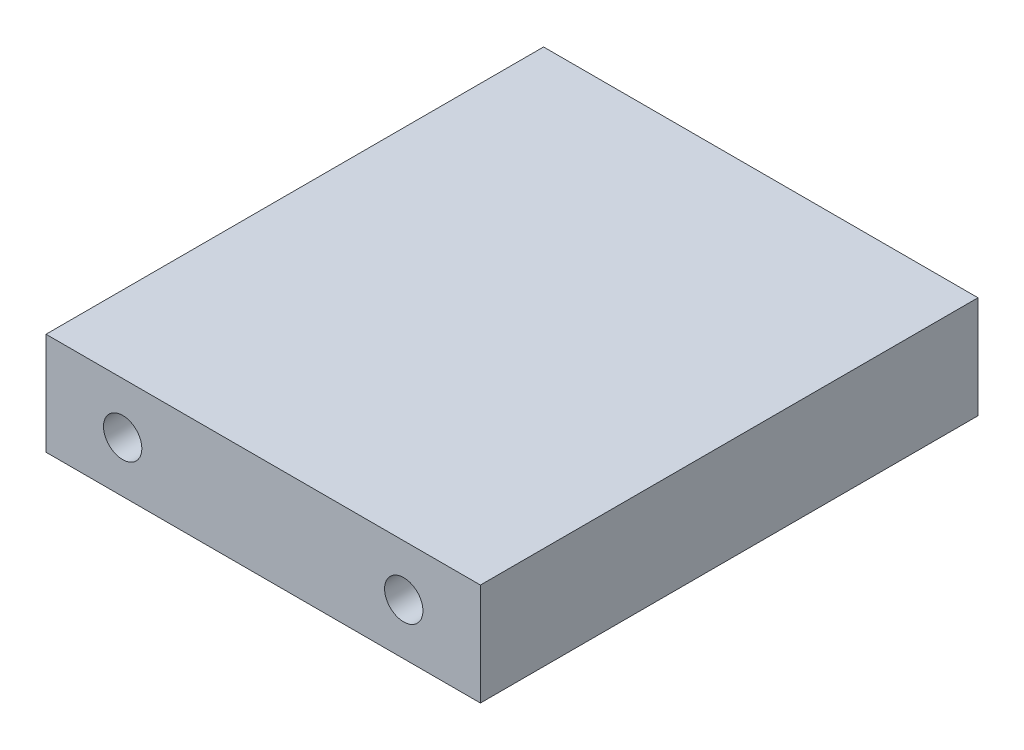
ISO-10303-21;
HEADER;
FILE_DESCRIPTION(('STEP AP214'),'2;1');
FILE_NAME('part.step','',(''),(''),'','','');
FILE_SCHEMA(('AUTOMOTIVE_DESIGN { 1 0 10303 214 1 1 1 1 }'));
ENDSEC;
DATA;
#1=APPLICATION_CONTEXT('core data for automotive mechanical design processes');
#2=APPLICATION_PROTOCOL_DEFINITION('international standard','automotive_design',2000,#1);
#3=PRODUCT_CONTEXT('',#1,'mechanical');
#4=PRODUCT('Part','Part','',(#3));
#5=PRODUCT_RELATED_PRODUCT_CATEGORY('part','',(#4));
#6=PRODUCT_DEFINITION_FORMATION('','',#4);
#7=PRODUCT_DEFINITION_CONTEXT('part definition',#1,'design');
#8=PRODUCT_DEFINITION('design','',#6,#7);
#9=PRODUCT_DEFINITION_SHAPE('','',#8);
#10=(LENGTH_UNIT() NAMED_UNIT(*) SI_UNIT(.MILLI.,.METRE.));
#11=(NAMED_UNIT(*) PLANE_ANGLE_UNIT() SI_UNIT($,.RADIAN.));
#12=(NAMED_UNIT(*) SI_UNIT($,.STERADIAN.) SOLID_ANGLE_UNIT());
#13=UNCERTAINTY_MEASURE_WITH_UNIT(LENGTH_MEASURE(1.E-05),#10,'distance_accuracy_value','');
#14=(GEOMETRIC_REPRESENTATION_CONTEXT(3) GLOBAL_UNCERTAINTY_ASSIGNED_CONTEXT((#13)) GLOBAL_UNIT_ASSIGNED_CONTEXT((#10,
#11,#12)) REPRESENTATION_CONTEXT('',''));
#15=CARTESIAN_POINT('',(0.,0.,0.));
#16=DIRECTION('',(0.,0.,1.));
#17=DIRECTION('',(1.,0.,0.));
#18=AXIS2_PLACEMENT_3D('',#15,#16,#17);
#19=CARTESIAN_POINT('',(0.,0.,123.65));
#20=DIRECTION('',(1.,0.,0.));
#21=DIRECTION('',(0.,0.,-1.));
#22=AXIS2_PLACEMENT_3D('',#19,#20,#21);
#23=PLANE('',#22);
#24=DIRECTION('',(0.,-1.,0.));
#25=VECTOR('',#24,1.);
#26=CARTESIAN_POINT('',(0.,0.,0.));
#27=LINE('',#26,#25);
#28=CARTESIAN_POINT('',(0.,0.,0.));
#29=VERTEX_POINT('',#28);
#30=CARTESIAN_POINT('',(0.,-25.4,0.));
#31=VERTEX_POINT('',#30);
#32=EDGE_CURVE('E125',#29,#31,#27,.T.);
#33=ORIENTED_EDGE('',*,*,#32,.T.);
#34=DIRECTION('',(0.,0.,-1.));
#35=VECTOR('',#34,1.);
#36=CARTESIAN_POINT('',(0.,-25.4,123.65));
#37=LINE('',#36,#35);
#38=CARTESIAN_POINT('',(0.,-25.4,123.65));
#39=VERTEX_POINT('',#38);
#40=EDGE_CURVE('E12',#39,#31,#37,.T.);
#41=ORIENTED_EDGE('',*,*,#40,.F.);
#42=DIRECTION('',(0.,-1.,0.));
#43=VECTOR('',#42,1.);
#44=CARTESIAN_POINT('',(0.,0.,123.65));
#45=LINE('',#44,#43);
#46=CARTESIAN_POINT('',(0.,0.,123.65));
#47=VERTEX_POINT('',#46);
#48=EDGE_CURVE('E108',#47,#39,#45,.T.);
#49=ORIENTED_EDGE('',*,*,#48,.F.);
#50=DIRECTION('',(0.,0.,-1.));
#51=VECTOR('',#50,1.);
#52=CARTESIAN_POINT('',(0.,0.,123.65));
#53=LINE('',#52,#51);
#54=EDGE_CURVE('E121',#47,#29,#53,.T.);
#55=ORIENTED_EDGE('',*,*,#54,.T.);
#56=EDGE_LOOP('',(#33,#41,#49,#55));
#57=FACE_BOUND('',#56,.T.);
#58=ADVANCED_FACE('F56',(#57),#23,.F.);
#59=CARTESIAN_POINT('',(0.,-25.4,123.65));
#60=DIRECTION('',(0.,1.,0.));
#61=DIRECTION('',(0.,0.,1.));
#62=AXIS2_PLACEMENT_3D('',#59,#60,#61);
#63=PLANE('',#62);
#64=DIRECTION('',(1.,0.,0.));
#65=VECTOR('',#64,1.);
#66=CARTESIAN_POINT('',(0.,-25.4,0.));
#67=LINE('',#66,#65);
#68=CARTESIAN_POINT('',(107.95,-25.4,0.));
#69=VERTEX_POINT('',#68);
#70=EDGE_CURVE('E113',#31,#69,#67,.T.);
#71=ORIENTED_EDGE('',*,*,#70,.T.);
#72=DIRECTION('',(0.,0.,-1.));
#73=VECTOR('',#72,1.);
#74=CARTESIAN_POINT('',(107.95,-25.4,123.65));
#75=LINE('',#74,#73);
#76=CARTESIAN_POINT('',(107.95,-25.4,123.65));
#77=VERTEX_POINT('',#76);
#78=EDGE_CURVE('E65',#77,#69,#75,.T.);
#79=ORIENTED_EDGE('',*,*,#78,.F.);
#80=DIRECTION('',(1.,0.,0.));
#81=VECTOR('',#80,1.);
#82=CARTESIAN_POINT('',(0.,-25.4,123.65));
#83=LINE('',#82,#81);
#84=EDGE_CURVE('E103',#39,#77,#83,.T.);
#85=ORIENTED_EDGE('',*,*,#84,.F.);
#86=ORIENTED_EDGE('',*,*,#40,.T.);
#87=EDGE_LOOP('',(#71,#79,#85,#86));
#88=FACE_BOUND('',#87,.T.);
#89=ADVANCED_FACE('F112',(#88),#63,.F.);
#90=CARTESIAN_POINT('',(107.95,0.,123.65));
#91=DIRECTION('',(-1.,0.,0.));
#92=DIRECTION('',(0.,0.,1.));
#93=AXIS2_PLACEMENT_3D('',#90,#91,#92);
#94=PLANE('',#93);
#95=DIRECTION('',(0.,1.,0.));
#96=VECTOR('',#95,1.);
#97=CARTESIAN_POINT('',(107.95,0.,0.));
#98=LINE('',#97,#96);
#99=CARTESIAN_POINT('',(107.95,0.,0.));
#100=VERTEX_POINT('',#99);
#101=EDGE_CURVE('E90',#69,#100,#98,.T.);
#102=ORIENTED_EDGE('',*,*,#101,.T.);
#103=DIRECTION('',(0.,0.,-1.));
#104=VECTOR('',#103,1.);
#105=CARTESIAN_POINT('',(107.95,0.,123.65));
#106=LINE('',#105,#104);
#107=CARTESIAN_POINT('',(107.95,0.,123.65));
#108=VERTEX_POINT('',#107);
#109=EDGE_CURVE('E115',#108,#100,#106,.T.);
#110=ORIENTED_EDGE('',*,*,#109,.F.);
#111=DIRECTION('',(0.,1.,0.));
#112=VECTOR('',#111,1.);
#113=CARTESIAN_POINT('',(107.95,0.,123.65));
#114=LINE('',#113,#112);
#115=EDGE_CURVE('E106',#77,#108,#114,.T.);
#116=ORIENTED_EDGE('',*,*,#115,.F.);
#117=ORIENTED_EDGE('',*,*,#78,.T.);
#118=EDGE_LOOP('',(#102,#110,#116,#117));
#119=FACE_BOUND('',#118,.T.);
#120=ADVANCED_FACE('F116',(#119),#94,.F.);
#121=CARTESIAN_POINT('',(0.,0.,123.65));
#122=DIRECTION('',(0.,-1.,0.));
#123=DIRECTION('',(0.,0.,-1.));
#124=AXIS2_PLACEMENT_3D('',#121,#122,#123);
#125=PLANE('',#124);
#126=DIRECTION('',(-1.,0.,0.));
#127=VECTOR('',#126,1.);
#128=CARTESIAN_POINT('',(0.,0.,0.));
#129=LINE('',#128,#127);
#130=EDGE_CURVE('E96',#100,#29,#129,.T.);
#131=ORIENTED_EDGE('',*,*,#130,.T.);
#132=ORIENTED_EDGE('',*,*,#54,.F.);
#133=DIRECTION('',(-1.,0.,0.));
#134=VECTOR('',#133,1.);
#135=CARTESIAN_POINT('',(0.,0.,123.65));
#136=LINE('',#135,#134);
#137=EDGE_CURVE('E73',#108,#47,#136,.T.);
#138=ORIENTED_EDGE('',*,*,#137,.F.);
#139=ORIENTED_EDGE('',*,*,#109,.T.);
#140=EDGE_LOOP('',(#131,#132,#138,#139));
#141=FACE_BOUND('',#140,.T.);
#142=ADVANCED_FACE('F188',(#141),#125,.F.);
#143=CARTESIAN_POINT('',(0.,0.,123.65));
#144=DIRECTION('',(0.,0.,1.));
#145=DIRECTION('',(1.,0.,0.));
#146=AXIS2_PLACEMENT_3D('',#143,#144,#145);
#147=PLANE('',#146);
#148=CARTESIAN_POINT('',(19.05,-12.7,123.65));
#149=DIRECTION('',(0.,0.,1.));
#150=DIRECTION('',(1.,0.,0.));
#151=AXIS2_PLACEMENT_3D('',#148,#149,#150);
#152=CIRCLE('',#151,4.7625);
#153=CARTESIAN_POINT('',(23.8125,-12.7,123.65));
#154=VERTEX_POINT('',#153);
#155=EDGE_CURVE('E166',#154,#154,#152,.T.);
#156=ORIENTED_EDGE('',*,*,#155,.F.);
#157=EDGE_LOOP('',(#156));
#158=FACE_BOUND('',#157,.T.);
#159=CARTESIAN_POINT('',(88.9,-12.7,123.65));
#160=DIRECTION('',(0.,0.,1.));
#161=DIRECTION('',(1.,0.,0.));
#162=AXIS2_PLACEMENT_3D('',#159,#160,#161);
#163=CIRCLE('',#162,4.76500000000001);
#164=CARTESIAN_POINT('',(93.665,-12.7,123.65));
#165=VERTEX_POINT('',#164);
#166=EDGE_CURVE('E175',#165,#165,#163,.T.);
#167=ORIENTED_EDGE('',*,*,#166,.F.);
#168=EDGE_LOOP('',(#167));
#169=FACE_BOUND('',#168,.T.);
#170=ORIENTED_EDGE('',*,*,#48,.T.);
#171=ORIENTED_EDGE('',*,*,#84,.T.);
#172=ORIENTED_EDGE('',*,*,#115,.T.);
#173=ORIENTED_EDGE('',*,*,#137,.T.);
#174=EDGE_LOOP('',(#170,#171,#172,#173));
#175=FACE_BOUND('',#174,.T.);
#176=ADVANCED_FACE('F104',(#158,#169,#175),#147,.T.);
#177=CARTESIAN_POINT('',(0.,0.,0.));
#178=DIRECTION('',(0.,0.,1.));
#179=DIRECTION('',(1.,0.,0.));
#180=AXIS2_PLACEMENT_3D('',#177,#178,#179);
#181=PLANE('',#180);
#182=CARTESIAN_POINT('',(19.05,-12.7,0.));
#183=DIRECTION('',(0.,0.,1.));
#184=DIRECTION('',(1.,0.,0.));
#185=AXIS2_PLACEMENT_3D('',#182,#183,#184);
#186=CIRCLE('',#185,4.7625);
#187=CARTESIAN_POINT('',(23.8125,-12.7,0.));
#188=VERTEX_POINT('',#187);
#189=EDGE_CURVE('E150',#188,#188,#186,.T.);
#190=ORIENTED_EDGE('',*,*,#189,.T.);
#191=EDGE_LOOP('',(#190));
#192=FACE_BOUND('',#191,.T.);
#193=CARTESIAN_POINT('',(88.9,-12.7,0.));
#194=DIRECTION('',(0.,0.,1.));
#195=DIRECTION('',(1.,0.,0.));
#196=AXIS2_PLACEMENT_3D('',#193,#194,#195);
#197=CIRCLE('',#196,4.76500000000001);
#198=CARTESIAN_POINT('',(93.665,-12.7,0.));
#199=VERTEX_POINT('',#198);
#200=EDGE_CURVE('E158',#199,#199,#197,.T.);
#201=ORIENTED_EDGE('',*,*,#200,.T.);
#202=EDGE_LOOP('',(#201));
#203=FACE_BOUND('',#202,.T.);
#204=ORIENTED_EDGE('',*,*,#32,.F.);
#205=ORIENTED_EDGE('',*,*,#130,.F.);
#206=ORIENTED_EDGE('',*,*,#101,.F.);
#207=ORIENTED_EDGE('',*,*,#70,.F.);
#208=EDGE_LOOP('',(#204,#205,#206,#207));
#209=FACE_BOUND('',#208,.T.);
#210=ADVANCED_FACE('F191',(#192,#203,#209),#181,.F.);
#211=CARTESIAN_POINT('',(88.9,-12.7,98.25));
#212=DIRECTION('',(0.,0.,1.));
#213=DIRECTION('',(1.,0.,0.));
#214=AXIS2_PLACEMENT_3D('',#211,#212,#213);
#215=CYLINDRICAL_SURFACE('',#214,4.76500000000001);
#216=CARTESIAN_POINT('',(88.9,-12.7,98.25));
#217=DIRECTION('',(0.,0.,1.));
#218=DIRECTION('',(1.,0.,0.));
#219=AXIS2_PLACEMENT_3D('',#216,#217,#218);
#220=CIRCLE('',#219,4.76500000000001);
#221=CARTESIAN_POINT('',(93.665,-12.7,98.25));
#222=VERTEX_POINT('',#221);
#223=EDGE_CURVE('E149',#222,#222,#220,.T.);
#224=ORIENTED_EDGE('',*,*,#223,.F.);
#225=EDGE_LOOP('',(#224));
#226=FACE_BOUND('',#225,.T.);
#227=ORIENTED_EDGE('',*,*,#166,.T.);
#228=EDGE_LOOP('',(#227));
#229=FACE_BOUND('',#228,.T.);
#230=ADVANCED_FACE('F207',(#226,#229),#215,.F.);
#231=CARTESIAN_POINT('',(88.9,-12.7,98.25));
#232=DIRECTION('',(0.,0.,1.));
#233=DIRECTION('',(1.,0.,0.));
#234=AXIS2_PLACEMENT_3D('',#231,#232,#233);
#235=PLANE('',#234);
#236=ORIENTED_EDGE('',*,*,#223,.T.);
#237=EDGE_LOOP('',(#236));
#238=FACE_BOUND('',#237,.T.);
#239=ADVANCED_FACE('F211',(#238),#235,.T.);
#240=CARTESIAN_POINT('',(19.05,-12.7,98.25));
#241=DIRECTION('',(0.,0.,1.));
#242=DIRECTION('',(1.,0.,0.));
#243=AXIS2_PLACEMENT_3D('',#240,#241,#242);
#244=CYLINDRICAL_SURFACE('',#243,4.7625);
#245=CARTESIAN_POINT('',(19.05,-12.7,98.25));
#246=DIRECTION('',(0.,0.,1.));
#247=DIRECTION('',(1.,0.,0.));
#248=AXIS2_PLACEMENT_3D('',#245,#246,#247);
#249=CIRCLE('',#248,4.7625);
#250=CARTESIAN_POINT('',(23.8125,-12.7,98.25));
#251=VERTEX_POINT('',#250);
#252=EDGE_CURVE('E129',#251,#251,#249,.T.);
#253=ORIENTED_EDGE('',*,*,#252,.F.);
#254=EDGE_LOOP('',(#253));
#255=FACE_BOUND('',#254,.T.);
#256=ORIENTED_EDGE('',*,*,#155,.T.);
#257=EDGE_LOOP('',(#256));
#258=FACE_BOUND('',#257,.T.);
#259=ADVANCED_FACE('F214',(#255,#258),#244,.F.);
#260=CARTESIAN_POINT('',(19.05,-12.7,98.25));
#261=DIRECTION('',(0.,0.,1.));
#262=DIRECTION('',(1.,0.,0.));
#263=AXIS2_PLACEMENT_3D('',#260,#261,#262);
#264=PLANE('',#263);
#265=ORIENTED_EDGE('',*,*,#252,.T.);
#266=EDGE_LOOP('',(#265));
#267=FACE_BOUND('',#266,.T.);
#268=ADVANCED_FACE('F221',(#267),#264,.T.);
#269=CARTESIAN_POINT('',(88.9,-12.7,25.4));
#270=DIRECTION('',(0.,0.,-1.));
#271=DIRECTION('',(-1.,0.,0.));
#272=AXIS2_PLACEMENT_3D('',#269,#270,#271);
#273=CYLINDRICAL_SURFACE('',#272,4.76500000000001);
#274=CARTESIAN_POINT('',(88.9,-12.7,25.4));
#275=DIRECTION('',(0.,0.,1.));
#276=DIRECTION('',(1.,0.,0.));
#277=AXIS2_PLACEMENT_3D('',#274,#275,#276);
#278=CIRCLE('',#277,4.76500000000001);
#279=CARTESIAN_POINT('',(93.665,-12.7,25.4));
#280=VERTEX_POINT('',#279);
#281=EDGE_CURVE('E153',#280,#280,#278,.T.);
#282=ORIENTED_EDGE('',*,*,#281,.T.);
#283=EDGE_LOOP('',(#282));
#284=FACE_BOUND('',#283,.T.);
#285=ORIENTED_EDGE('',*,*,#200,.F.);
#286=EDGE_LOOP('',(#285));
#287=FACE_BOUND('',#286,.T.);
#288=ADVANCED_FACE('F225',(#284,#287),#273,.F.);
#289=CARTESIAN_POINT('',(88.9,-12.7,25.4));
#290=DIRECTION('',(0.,0.,-1.));
#291=DIRECTION('',(1.,0.,0.));
#292=AXIS2_PLACEMENT_3D('',#289,#290,#291);
#293=PLANE('',#292);
#294=ORIENTED_EDGE('',*,*,#281,.F.);
#295=EDGE_LOOP('',(#294));
#296=FACE_BOUND('',#295,.T.);
#297=ADVANCED_FACE('F229',(#296),#293,.T.);
#298=CARTESIAN_POINT('',(19.05,-12.7,25.4));
#299=DIRECTION('',(0.,0.,-1.));
#300=DIRECTION('',(-1.,0.,0.));
#301=AXIS2_PLACEMENT_3D('',#298,#299,#300);
#302=CYLINDRICAL_SURFACE('',#301,4.7625);
#303=CARTESIAN_POINT('',(19.05,-12.7,25.4));
#304=DIRECTION('',(0.,0.,1.));
#305=DIRECTION('',(1.,0.,0.));
#306=AXIS2_PLACEMENT_3D('',#303,#304,#305);
#307=CIRCLE('',#306,4.7625);
#308=CARTESIAN_POINT('',(23.8125,-12.7,25.4));
#309=VERTEX_POINT('',#308);
#310=EDGE_CURVE('E144',#309,#309,#307,.T.);
#311=ORIENTED_EDGE('',*,*,#310,.T.);
#312=EDGE_LOOP('',(#311));
#313=FACE_BOUND('',#312,.T.);
#314=ORIENTED_EDGE('',*,*,#189,.F.);
#315=EDGE_LOOP('',(#314));
#316=FACE_BOUND('',#315,.T.);
#317=ADVANCED_FACE('F233',(#313,#316),#302,.F.);
#318=CARTESIAN_POINT('',(19.05,-12.7,25.4));
#319=DIRECTION('',(0.,0.,-1.));
#320=DIRECTION('',(1.,0.,0.));
#321=AXIS2_PLACEMENT_3D('',#318,#319,#320);
#322=PLANE('',#321);
#323=ORIENTED_EDGE('',*,*,#310,.F.);
#324=EDGE_LOOP('',(#323));
#325=FACE_BOUND('',#324,.T.);
#326=ADVANCED_FACE('F237',(#325),#322,.T.);
#327=CLOSED_SHELL('',(#58,#89,#120,#142,#176,#210,#230,#239,#259,#268,#288,#297,#317,#326));
#328=MANIFOLD_SOLID_BREP('B2',#327);
#329=ADVANCED_BREP_SHAPE_REPRESENTATION('',(#18,#328),#14);
#330=SHAPE_DEFINITION_REPRESENTATION(#9,#329);
ENDSEC;
END-ISO-10303-21;
